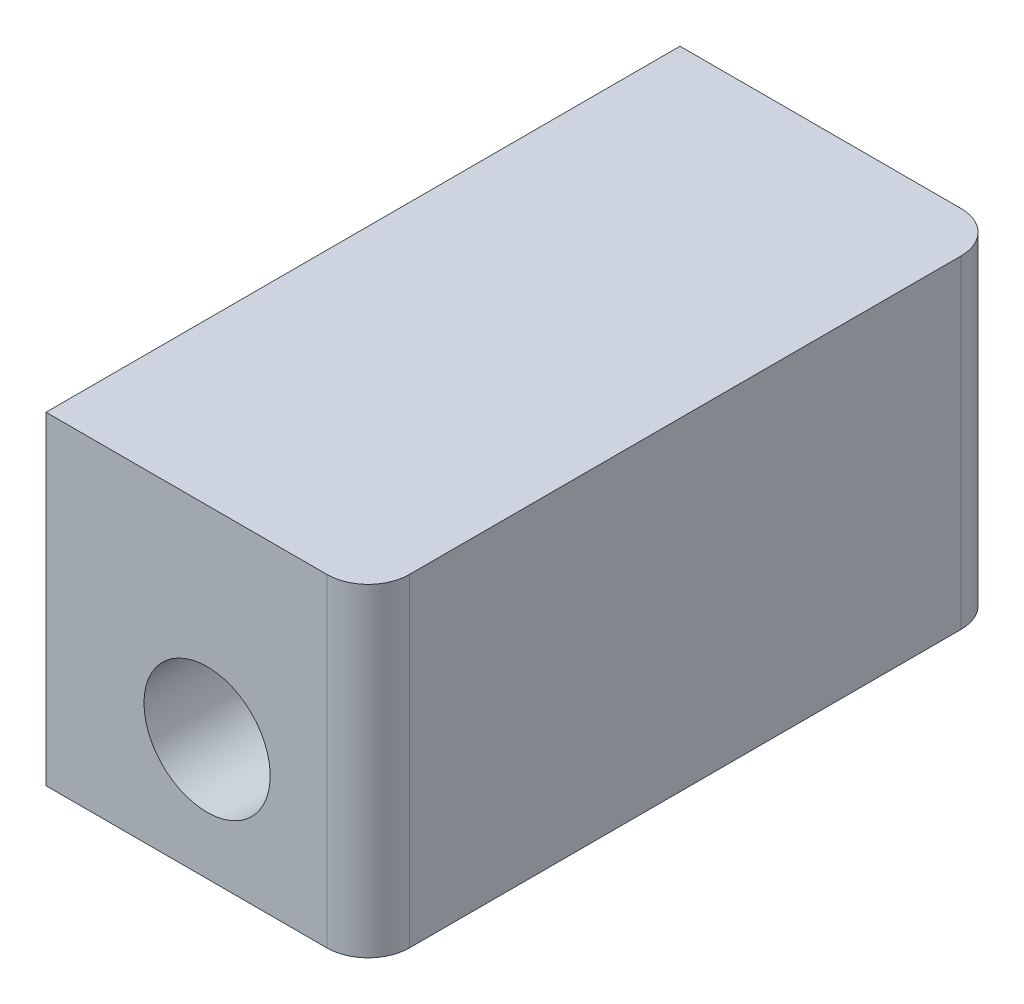
ISO-10303-21;
HEADER;
FILE_DESCRIPTION(('STEP AP214'),'2;1');
FILE_NAME('part.step','',(''),(''),'','','');
FILE_SCHEMA(('AUTOMOTIVE_DESIGN { 1 0 10303 214 1 1 1 1 }'));
ENDSEC;
DATA;
#1=APPLICATION_CONTEXT('core data for automotive mechanical design processes');
#2=APPLICATION_PROTOCOL_DEFINITION('international standard','automotive_design',2000,#1);
#3=PRODUCT_CONTEXT('',#1,'mechanical');
#4=PRODUCT('Part','Part','',(#3));
#5=PRODUCT_RELATED_PRODUCT_CATEGORY('part','',(#4));
#6=PRODUCT_DEFINITION_FORMATION('','',#4);
#7=PRODUCT_DEFINITION_CONTEXT('part definition',#1,'design');
#8=PRODUCT_DEFINITION('design','',#6,#7);
#9=PRODUCT_DEFINITION_SHAPE('','',#8);
#10=(LENGTH_UNIT() NAMED_UNIT(*) SI_UNIT(.MILLI.,.METRE.));
#11=(NAMED_UNIT(*) PLANE_ANGLE_UNIT() SI_UNIT($,.RADIAN.));
#12=(NAMED_UNIT(*) SI_UNIT($,.STERADIAN.) SOLID_ANGLE_UNIT());
#13=UNCERTAINTY_MEASURE_WITH_UNIT(LENGTH_MEASURE(1.E-05),#10,'distance_accuracy_value','');
#14=(GEOMETRIC_REPRESENTATION_CONTEXT(3) GLOBAL_UNCERTAINTY_ASSIGNED_CONTEXT((#13)) GLOBAL_UNIT_ASSIGNED_CONTEXT((#10,
#11,#12)) REPRESENTATION_CONTEXT('',''));
#15=CARTESIAN_POINT('',(0.,0.,0.));
#16=DIRECTION('',(0.,0.,1.));
#17=DIRECTION('',(1.,0.,0.));
#18=AXIS2_PLACEMENT_3D('',#15,#16,#17);
#19=CARTESIAN_POINT('',(6.225,6.25,12.25));
#20=DIRECTION('',(-1.,0.,0.));
#21=DIRECTION('',(0.,0.,1.));
#22=AXIS2_PLACEMENT_3D('',#19,#20,#21);
#23=PLANE('',#22);
#24=DIRECTION('',(0.,0.,-1.));
#25=VECTOR('',#24,1.);
#26=CARTESIAN_POINT('',(6.225,6.25,12.25));
#27=LINE('',#26,#25);
#28=CARTESIAN_POINT('',(6.225,6.25,10.6625));
#29=VERTEX_POINT('',#28);
#30=CARTESIAN_POINT('',(6.225,6.25,-10.6625));
#31=VERTEX_POINT('',#30);
#32=EDGE_CURVE('E102',#29,#31,#27,.T.);
#33=ORIENTED_EDGE('',*,*,#32,.F.);
#34=DIRECTION('',(0.,-1.,0.));
#35=VECTOR('',#34,1.);
#36=CARTESIAN_POINT('',(6.225,6.25,10.6625));
#37=LINE('',#36,#35);
#38=CARTESIAN_POINT('',(6.225,-6.25,10.6625));
#39=VERTEX_POINT('',#38);
#40=EDGE_CURVE('E141',#29,#39,#37,.T.);
#41=ORIENTED_EDGE('',*,*,#40,.T.);
#42=DIRECTION('',(0.,0.,-1.));
#43=VECTOR('',#42,1.);
#44=CARTESIAN_POINT('',(6.225,-6.25,12.25));
#45=LINE('',#44,#43);
#46=CARTESIAN_POINT('',(6.225,-6.25,-10.6625));
#47=VERTEX_POINT('',#46);
#48=EDGE_CURVE('E124',#39,#47,#45,.T.);
#49=ORIENTED_EDGE('',*,*,#48,.T.);
#50=DIRECTION('',(0.,-1.,0.));
#51=VECTOR('',#50,1.);
#52=CARTESIAN_POINT('',(6.225,6.25,-10.6625));
#53=LINE('',#52,#51);
#54=EDGE_CURVE('E112',#47,#31,#53,.F.);
#55=ORIENTED_EDGE('',*,*,#54,.T.);
#56=EDGE_LOOP('',(#33,#41,#49,#55));
#57=FACE_BOUND('',#56,.T.);
#58=ADVANCED_FACE('F39',(#57),#23,.F.);
#59=CARTESIAN_POINT('',(-6.225,6.25,-12.25));
#60=DIRECTION('',(0.,0.,1.));
#61=DIRECTION('',(1.,0.,0.));
#62=AXIS2_PLACEMENT_3D('',#59,#60,#61);
#63=PLANE('',#62);
#64=CARTESIAN_POINT('',(0.,-1.58749999999999,-12.25));
#65=DIRECTION('',(0.,0.,-1.));
#66=DIRECTION('',(-1.,0.,0.));
#67=AXIS2_PLACEMENT_3D('',#64,#65,#66);
#68=CIRCLE('',#67,2.4384);
#69=CARTESIAN_POINT('',(-2.4384,-1.58749999999999,-12.25));
#70=VERTEX_POINT('',#69);
#71=EDGE_CURVE('E204',#70,#70,#68,.T.);
#72=ORIENTED_EDGE('',*,*,#71,.F.);
#73=EDGE_LOOP('',(#72));
#74=FACE_BOUND('',#73,.T.);
#75=DIRECTION('',(-1.,0.,0.));
#76=VECTOR('',#75,1.);
#77=CARTESIAN_POINT('',(-6.225,6.25,-12.25));
#78=LINE('',#77,#76);
#79=CARTESIAN_POINT('',(4.6375,6.25,-12.25));
#80=VERTEX_POINT('',#79);
#81=CARTESIAN_POINT('',(-6.225,6.25,-12.25));
#82=VERTEX_POINT('',#81);
#83=EDGE_CURVE('E93',#80,#82,#78,.T.);
#84=ORIENTED_EDGE('',*,*,#83,.F.);
#85=DIRECTION('',(0.,-1.,0.));
#86=VECTOR('',#85,1.);
#87=CARTESIAN_POINT('',(4.6375,6.25,-12.25));
#88=LINE('',#87,#86);
#89=CARTESIAN_POINT('',(4.6375,-6.25,-12.25));
#90=VERTEX_POINT('',#89);
#91=EDGE_CURVE('E11',#80,#90,#88,.T.);
#92=ORIENTED_EDGE('',*,*,#91,.T.);
#93=DIRECTION('',(-1.,0.,0.));
#94=VECTOR('',#93,1.);
#95=CARTESIAN_POINT('',(-6.225,-6.25,-12.25));
#96=LINE('',#95,#94);
#97=CARTESIAN_POINT('',(-6.225,-6.25,-12.25));
#98=VERTEX_POINT('',#97);
#99=EDGE_CURVE('E108',#90,#98,#96,.T.);
#100=ORIENTED_EDGE('',*,*,#99,.T.);
#101=DIRECTION('',(0.,-1.,0.));
#102=VECTOR('',#101,1.);
#103=CARTESIAN_POINT('',(-6.225,6.25,-12.25));
#104=LINE('',#103,#102);
#105=EDGE_CURVE('E105',#82,#98,#104,.T.);
#106=ORIENTED_EDGE('',*,*,#105,.F.);
#107=EDGE_LOOP('',(#84,#92,#100,#106));
#108=FACE_BOUND('',#107,.T.);
#109=ADVANCED_FACE('F106',(#74,#108),#63,.F.);
#110=CARTESIAN_POINT('',(-6.225,6.25,12.25));
#111=DIRECTION('',(1.,0.,0.));
#112=DIRECTION('',(0.,0.,-1.));
#113=AXIS2_PLACEMENT_3D('',#110,#111,#112);
#114=PLANE('',#113);
#115=DIRECTION('',(0.,0.,1.));
#116=VECTOR('',#115,1.);
#117=CARTESIAN_POINT('',(-6.225,-6.25,12.25));
#118=LINE('',#117,#116);
#119=CARTESIAN_POINT('',(-6.225,-6.25,12.25));
#120=VERTEX_POINT('',#119);
#121=EDGE_CURVE('E131',#98,#120,#118,.T.);
#122=ORIENTED_EDGE('',*,*,#121,.T.);
#123=DIRECTION('',(0.,-1.,0.));
#124=VECTOR('',#123,1.);
#125=CARTESIAN_POINT('',(-6.225,6.25,12.25));
#126=LINE('',#125,#124);
#127=CARTESIAN_POINT('',(-6.225,6.25,12.25));
#128=VERTEX_POINT('',#127);
#129=EDGE_CURVE('E113',#128,#120,#126,.T.);
#130=ORIENTED_EDGE('',*,*,#129,.F.);
#131=DIRECTION('',(0.,0.,1.));
#132=VECTOR('',#131,1.);
#133=CARTESIAN_POINT('',(-6.225,6.25,12.25));
#134=LINE('',#133,#132);
#135=EDGE_CURVE('E97',#82,#128,#134,.T.);
#136=ORIENTED_EDGE('',*,*,#135,.F.);
#137=ORIENTED_EDGE('',*,*,#105,.T.);
#138=EDGE_LOOP('',(#122,#130,#136,#137));
#139=FACE_BOUND('',#138,.T.);
#140=ADVANCED_FACE('F115',(#139),#114,.F.);
#141=CARTESIAN_POINT('',(-6.225,6.25,12.25));
#142=DIRECTION('',(0.,0.,-1.));
#143=DIRECTION('',(-1.,0.,0.));
#144=AXIS2_PLACEMENT_3D('',#141,#142,#143);
#145=PLANE('',#144);
#146=CARTESIAN_POINT('',(0.,-1.58749999999999,12.25));
#147=DIRECTION('',(0.,0.,-1.));
#148=DIRECTION('',(-1.,0.,0.));
#149=AXIS2_PLACEMENT_3D('',#146,#147,#148);
#150=CIRCLE('',#149,2.4384);
#151=CARTESIAN_POINT('',(-2.4384,-1.58749999999999,12.25));
#152=VERTEX_POINT('',#151);
#153=EDGE_CURVE('E128',#152,#152,#150,.T.);
#154=ORIENTED_EDGE('',*,*,#153,.T.);
#155=EDGE_LOOP('',(#154));
#156=FACE_BOUND('',#155,.T.);
#157=DIRECTION('',(1.,0.,0.));
#158=VECTOR('',#157,1.);
#159=CARTESIAN_POINT('',(-6.225,-6.25,12.25));
#160=LINE('',#159,#158);
#161=CARTESIAN_POINT('',(4.6375,-6.25,12.25));
#162=VERTEX_POINT('',#161);
#163=EDGE_CURVE('E134',#120,#162,#160,.T.);
#164=ORIENTED_EDGE('',*,*,#163,.T.);
#165=DIRECTION('',(0.,-1.,0.));
#166=VECTOR('',#165,1.);
#167=CARTESIAN_POINT('',(4.6375,6.25,12.25));
#168=LINE('',#167,#166);
#169=CARTESIAN_POINT('',(4.6375,6.25,12.25));
#170=VERTEX_POINT('',#169);
#171=EDGE_CURVE('E63',#162,#170,#168,.F.);
#172=ORIENTED_EDGE('',*,*,#171,.T.);
#173=DIRECTION('',(1.,0.,0.));
#174=VECTOR('',#173,1.);
#175=CARTESIAN_POINT('',(-6.225,6.25,12.25));
#176=LINE('',#175,#174);
#177=EDGE_CURVE('E118',#128,#170,#176,.T.);
#178=ORIENTED_EDGE('',*,*,#177,.F.);
#179=ORIENTED_EDGE('',*,*,#129,.T.);
#180=EDGE_LOOP('',(#164,#172,#178,#179));
#181=FACE_BOUND('',#180,.T.);
#182=ADVANCED_FACE('F167',(#156,#181),#145,.F.);
#183=CARTESIAN_POINT('',(0.,6.25,0.));
#184=DIRECTION('',(0.,-1.,0.));
#185=DIRECTION('',(0.,0.,-1.));
#186=AXIS2_PLACEMENT_3D('',#183,#184,#185);
#187=PLANE('',#186);
#188=ORIENTED_EDGE('',*,*,#177,.T.);
#189=CARTESIAN_POINT('',(4.6375,6.25,10.6625));
#190=DIRECTION('',(0.,-1.,0.));
#191=DIRECTION('',(0.,0.,-1.));
#192=AXIS2_PLACEMENT_3D('',#189,#190,#191);
#193=CIRCLE('',#192,1.5875);
#194=EDGE_CURVE('E48',#170,#29,#193,.F.);
#195=ORIENTED_EDGE('',*,*,#194,.T.);
#196=ORIENTED_EDGE('',*,*,#32,.T.);
#197=CARTESIAN_POINT('',(4.6375,6.25,-10.6625));
#198=DIRECTION('',(0.,-1.,0.));
#199=DIRECTION('',(0.,0.,-1.));
#200=AXIS2_PLACEMENT_3D('',#197,#198,#199);
#201=CIRCLE('',#200,1.5875);
#202=EDGE_CURVE('E55',#31,#80,#201,.F.);
#203=ORIENTED_EDGE('',*,*,#202,.T.);
#204=ORIENTED_EDGE('',*,*,#83,.T.);
#205=ORIENTED_EDGE('',*,*,#135,.T.);
#206=EDGE_LOOP('',(#188,#195,#196,#203,#204,#205));
#207=FACE_BOUND('',#206,.T.);
#208=ADVANCED_FACE('F95',(#207),#187,.F.);
#209=CARTESIAN_POINT('',(0.,-6.25,0.));
#210=DIRECTION('',(0.,-1.,0.));
#211=DIRECTION('',(0.,0.,-1.));
#212=AXIS2_PLACEMENT_3D('',#209,#210,#211);
#213=PLANE('',#212);
#214=ORIENTED_EDGE('',*,*,#48,.F.);
#215=CARTESIAN_POINT('',(4.6375,-6.25,10.6625));
#216=DIRECTION('',(0.,-1.,0.));
#217=DIRECTION('',(0.,0.,-1.));
#218=AXIS2_PLACEMENT_3D('',#215,#216,#217);
#219=CIRCLE('',#218,1.5875);
#220=EDGE_CURVE('E148',#39,#162,#219,.T.);
#221=ORIENTED_EDGE('',*,*,#220,.T.);
#222=ORIENTED_EDGE('',*,*,#163,.F.);
#223=ORIENTED_EDGE('',*,*,#121,.F.);
#224=ORIENTED_EDGE('',*,*,#99,.F.);
#225=CARTESIAN_POINT('',(4.6375,-6.25,-10.6625));
#226=DIRECTION('',(0.,-1.,0.));
#227=DIRECTION('',(0.,0.,-1.));
#228=AXIS2_PLACEMENT_3D('',#225,#226,#227);
#229=CIRCLE('',#228,1.5875);
#230=EDGE_CURVE('E145',#90,#47,#229,.T.);
#231=ORIENTED_EDGE('',*,*,#230,.T.);
#232=EDGE_LOOP('',(#214,#221,#222,#223,#224,#231));
#233=FACE_BOUND('',#232,.T.);
#234=ADVANCED_FACE('F166',(#233),#213,.T.);
#235=CARTESIAN_POINT('',(4.6375,6.25,10.6625));
#236=DIRECTION('',(0.,-1.,0.));
#237=DIRECTION('',(0.,0.,-1.));
#238=AXIS2_PLACEMENT_3D('',#235,#236,#237);
#239=CYLINDRICAL_SURFACE('',#238,1.5875);
#240=ORIENTED_EDGE('',*,*,#194,.F.);
#241=ORIENTED_EDGE('',*,*,#171,.F.);
#242=ORIENTED_EDGE('',*,*,#220,.F.);
#243=ORIENTED_EDGE('',*,*,#40,.F.);
#244=EDGE_LOOP('',(#240,#241,#242,#243));
#245=FACE_BOUND('',#244,.T.);
#246=ADVANCED_FACE('F163',(#245),#239,.T.);
#247=CARTESIAN_POINT('',(4.6375,6.25,-10.6625));
#248=DIRECTION('',(0.,-1.,0.));
#249=DIRECTION('',(0.,0.,-1.));
#250=AXIS2_PLACEMENT_3D('',#247,#248,#249);
#251=CYLINDRICAL_SURFACE('',#250,1.5875);
#252=ORIENTED_EDGE('',*,*,#202,.F.);
#253=ORIENTED_EDGE('',*,*,#54,.F.);
#254=ORIENTED_EDGE('',*,*,#230,.F.);
#255=ORIENTED_EDGE('',*,*,#91,.F.);
#256=EDGE_LOOP('',(#252,#253,#254,#255));
#257=FACE_BOUND('',#256,.T.);
#258=ADVANCED_FACE('F41',(#257),#251,.T.);
#259=CARTESIAN_POINT('',(0.,-1.58749999999999,12.25));
#260=DIRECTION('',(0.,0.,-1.));
#261=DIRECTION('',(-1.,0.,0.));
#262=AXIS2_PLACEMENT_3D('',#259,#260,#261);
#263=CYLINDRICAL_SURFACE('',#262,2.4384);
#264=ORIENTED_EDGE('',*,*,#153,.F.);
#265=EDGE_LOOP('',(#264));
#266=FACE_BOUND('',#265,.T.);
#267=ORIENTED_EDGE('',*,*,#71,.T.);
#268=EDGE_LOOP('',(#267));
#269=FACE_BOUND('',#268,.T.);
#270=ADVANCED_FACE('F191',(#266,#269),#263,.F.);
#271=CLOSED_SHELL('',(#58,#109,#140,#182,#208,#234,#246,#258,#270));
#272=MANIFOLD_SOLID_BREP('B2',#271);
#273=ADVANCED_BREP_SHAPE_REPRESENTATION('',(#18,#272),#14);
#274=SHAPE_DEFINITION_REPRESENTATION(#9,#273);
ENDSEC;
END-ISO-10303-21;
